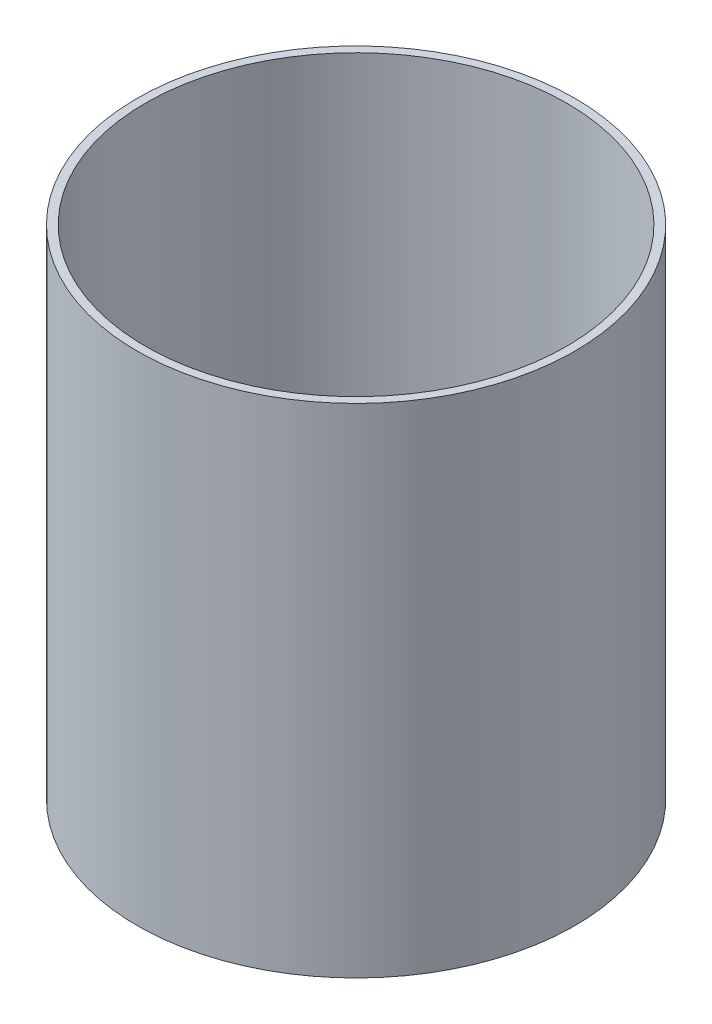
ISO-10303-21;
HEADER;
FILE_DESCRIPTION(('STEP AP214'),'2;1');
FILE_NAME('part.step','',(''),(''),'','','');
FILE_SCHEMA(('AUTOMOTIVE_DESIGN { 1 0 10303 214 1 1 1 1 }'));
ENDSEC;
DATA;
#1=APPLICATION_CONTEXT('core data for automotive mechanical design processes');
#2=APPLICATION_PROTOCOL_DEFINITION('international standard','automotive_design',2000,#1);
#3=PRODUCT_CONTEXT('',#1,'mechanical');
#4=PRODUCT('Part','Part','',(#3));
#5=PRODUCT_RELATED_PRODUCT_CATEGORY('part','',(#4));
#6=PRODUCT_DEFINITION_FORMATION('','',#4);
#7=PRODUCT_DEFINITION_CONTEXT('part definition',#1,'design');
#8=PRODUCT_DEFINITION('design','',#6,#7);
#9=PRODUCT_DEFINITION_SHAPE('','',#8);
#10=(LENGTH_UNIT() NAMED_UNIT(*) SI_UNIT(.MILLI.,.METRE.));
#11=(NAMED_UNIT(*) PLANE_ANGLE_UNIT() SI_UNIT($,.RADIAN.));
#12=(NAMED_UNIT(*) SI_UNIT($,.STERADIAN.) SOLID_ANGLE_UNIT());
#13=UNCERTAINTY_MEASURE_WITH_UNIT(LENGTH_MEASURE(1.E-05),#10,'distance_accuracy_value','');
#14=(GEOMETRIC_REPRESENTATION_CONTEXT(3) GLOBAL_UNCERTAINTY_ASSIGNED_CONTEXT((#13)) GLOBAL_UNIT_ASSIGNED_CONTEXT((#10,
#11,#12)) REPRESENTATION_CONTEXT('',''));
#15=CARTESIAN_POINT('',(0.,0.,0.));
#16=DIRECTION('',(0.,0.,1.));
#17=DIRECTION('',(1.,0.,0.));
#18=AXIS2_PLACEMENT_3D('',#15,#16,#17);
#19=CARTESIAN_POINT('',(0.,90.,0.));
#20=DIRECTION('',(0.,1.,0.));
#21=DIRECTION('',(0.,0.,1.));
#22=AXIS2_PLACEMENT_3D('',#19,#20,#21);
#23=PLANE('',#22);
#24=CARTESIAN_POINT('',(0.,90.,0.));
#25=DIRECTION('',(0.,1.,0.));
#26=DIRECTION('',(0.,0.,1.));
#27=AXIS2_PLACEMENT_3D('',#24,#25,#26);
#28=CIRCLE('',#27,39.6);
#29=CARTESIAN_POINT('',(0.,90.,-39.6));
#30=VERTEX_POINT('',#29);
#31=EDGE_CURVE('E10',#30,#30,#28,.T.);
#32=ORIENTED_EDGE('',*,*,#31,.T.);
#33=EDGE_LOOP('',(#32));
#34=FACE_BOUND('',#33,.T.);
#35=CARTESIAN_POINT('',(0.,90.,0.));
#36=DIRECTION('',(0.,1.,0.));
#37=DIRECTION('',(0.,0.,1.));
#38=AXIS2_PLACEMENT_3D('',#35,#36,#37);
#39=CIRCLE('',#38,38.1);
#40=CARTESIAN_POINT('',(0.,90.,-38.1));
#41=VERTEX_POINT('',#40);
#42=EDGE_CURVE('E45',#41,#41,#39,.T.);
#43=ORIENTED_EDGE('',*,*,#42,.F.);
#44=EDGE_LOOP('',(#43));
#45=FACE_BOUND('',#44,.T.);
#46=ADVANCED_FACE('F34',(#34,#45),#23,.T.);
#47=CARTESIAN_POINT('',(0.,0.,0.));
#48=DIRECTION('',(0.,1.,0.));
#49=DIRECTION('',(0.,0.,1.));
#50=AXIS2_PLACEMENT_3D('',#47,#48,#49);
#51=PLANE('',#50);
#52=CARTESIAN_POINT('',(0.,0.,0.));
#53=DIRECTION('',(0.,1.,0.));
#54=DIRECTION('',(0.,0.,1.));
#55=AXIS2_PLACEMENT_3D('',#52,#53,#54);
#56=CIRCLE('',#55,39.6);
#57=CARTESIAN_POINT('',(0.,0.,-39.6));
#58=VERTEX_POINT('',#57);
#59=EDGE_CURVE('E38',#58,#58,#56,.T.);
#60=ORIENTED_EDGE('',*,*,#59,.F.);
#61=EDGE_LOOP('',(#60));
#62=FACE_BOUND('',#61,.T.);
#63=CARTESIAN_POINT('',(0.,0.,0.));
#64=DIRECTION('',(0.,1.,0.));
#65=DIRECTION('',(0.,0.,1.));
#66=AXIS2_PLACEMENT_3D('',#63,#64,#65);
#67=CIRCLE('',#66,38.1);
#68=CARTESIAN_POINT('',(0.,0.,-38.1));
#69=VERTEX_POINT('',#68);
#70=EDGE_CURVE('E47',#69,#69,#67,.T.);
#71=ORIENTED_EDGE('',*,*,#70,.T.);
#72=EDGE_LOOP('',(#71));
#73=FACE_BOUND('',#72,.T.);
#74=ADVANCED_FACE('F57',(#62,#73),#51,.F.);
#75=CARTESIAN_POINT('',(0.,90.,0.));
#76=DIRECTION('',(0.,-1.,0.));
#77=DIRECTION('',(0.,0.,-1.));
#78=AXIS2_PLACEMENT_3D('',#75,#76,#77);
#79=CYLINDRICAL_SURFACE('',#78,39.6);
#80=CARTESIAN_POINT('',(0.,90.,-39.6));
#81=CARTESIAN_POINT('',(0.,89.0625,-39.6));
#82=CARTESIAN_POINT('',(0.,88.125,-39.6));
#83=CARTESIAN_POINT('',(0.,86.25,-39.6));
#84=CARTESIAN_POINT('',(0.,85.3125,-39.6));
#85=CARTESIAN_POINT('',(0.,83.4375,-39.6));
#86=CARTESIAN_POINT('',(0.,82.5,-39.6));
#87=CARTESIAN_POINT('',(0.,80.625,-39.6));
#88=CARTESIAN_POINT('',(0.,79.6875,-39.6));
#89=CARTESIAN_POINT('',(0.,77.8125,-39.6));
#90=CARTESIAN_POINT('',(0.,76.875,-39.6));
#91=CARTESIAN_POINT('',(0.,75.,-39.6));
#92=CARTESIAN_POINT('',(0.,74.0625,-39.6));
#93=CARTESIAN_POINT('',(0.,72.1875,-39.6));
#94=CARTESIAN_POINT('',(0.,71.25,-39.6));
#95=CARTESIAN_POINT('',(0.,69.375,-39.6));
#96=CARTESIAN_POINT('',(0.,68.4375,-39.6));
#97=CARTESIAN_POINT('',(0.,66.5625,-39.6));
#98=CARTESIAN_POINT('',(0.,65.625,-39.6));
#99=CARTESIAN_POINT('',(0.,63.75,-39.6));
#100=CARTESIAN_POINT('',(0.,62.8125,-39.6));
#101=CARTESIAN_POINT('',(0.,60.9375,-39.6));
#102=CARTESIAN_POINT('',(0.,60.,-39.6));
#103=CARTESIAN_POINT('',(0.,58.125,-39.6));
#104=CARTESIAN_POINT('',(0.,57.1875,-39.6));
#105=CARTESIAN_POINT('',(0.,55.3125,-39.6));
#106=CARTESIAN_POINT('',(0.,54.375,-39.6));
#107=CARTESIAN_POINT('',(0.,52.5,-39.6));
#108=CARTESIAN_POINT('',(0.,51.5625,-39.6));
#109=CARTESIAN_POINT('',(0.,49.6875,-39.6));
#110=CARTESIAN_POINT('',(0.,48.75,-39.6));
#111=CARTESIAN_POINT('',(0.,46.875,-39.6));
#112=CARTESIAN_POINT('',(0.,45.9375,-39.6));
#113=CARTESIAN_POINT('',(0.,44.0625,-39.6));
#114=CARTESIAN_POINT('',(0.,43.125,-39.6));
#115=CARTESIAN_POINT('',(0.,41.25,-39.6));
#116=CARTESIAN_POINT('',(0.,40.3125,-39.6));
#117=CARTESIAN_POINT('',(0.,38.4375,-39.6));
#118=CARTESIAN_POINT('',(0.,37.5,-39.6));
#119=CARTESIAN_POINT('',(0.,35.625,-39.6));
#120=CARTESIAN_POINT('',(0.,34.6875,-39.6));
#121=CARTESIAN_POINT('',(0.,32.8125,-39.6));
#122=CARTESIAN_POINT('',(0.,31.875,-39.6));
#123=CARTESIAN_POINT('',(0.,30.,-39.6));
#124=CARTESIAN_POINT('',(0.,29.0625,-39.6));
#125=CARTESIAN_POINT('',(0.,27.1875,-39.6));
#126=CARTESIAN_POINT('',(0.,26.25,-39.6));
#127=CARTESIAN_POINT('',(0.,24.375,-39.6));
#128=CARTESIAN_POINT('',(0.,23.4375,-39.6));
#129=CARTESIAN_POINT('',(0.,21.5625,-39.6));
#130=CARTESIAN_POINT('',(0.,20.625,-39.6));
#131=CARTESIAN_POINT('',(0.,18.75,-39.6));
#132=CARTESIAN_POINT('',(0.,17.8125,-39.6));
#133=CARTESIAN_POINT('',(0.,15.9375,-39.6));
#134=CARTESIAN_POINT('',(0.,15.,-39.6));
#135=CARTESIAN_POINT('',(0.,13.125,-39.6));
#136=CARTESIAN_POINT('',(0.,12.1875,-39.6));
#137=CARTESIAN_POINT('',(0.,10.3125,-39.6));
#138=CARTESIAN_POINT('',(0.,9.37499999999999,-39.6));
#139=CARTESIAN_POINT('',(0.,7.49999999999999,-39.6));
#140=CARTESIAN_POINT('',(0.,6.56249999999999,-39.6));
#141=CARTESIAN_POINT('',(0.,4.68749999999999,-39.6));
#142=CARTESIAN_POINT('',(0.,3.74999999999998,-39.6));
#143=CARTESIAN_POINT('',(0.,1.87499999999998,-39.6));
#144=CARTESIAN_POINT('',(0.,0.937499999999986,-39.6));
#145=CARTESIAN_POINT('',(0.,0.,-39.6));
#146=B_SPLINE_CURVE_WITH_KNOTS('',3,(#80,#81,#82,#83,#84,#85,#86,#87,#88,#89,#90,#91,#92,#93,
#94,#95,#96,#97,#98,#99,#100,#101,#102,#103,#104,#105,#106,#107,#108,#109,#110,#111,#112,#113,
#114,#115,#116,#117,#118,#119,#120,#121,#122,#123,#124,#125,#126,#127,#128,#129,#130,#131,#132,
#133,#134,#135,#136,#137,#138,#139,#140,#141,#142,#143,#144,#145),.UNSPECIFIED.,.F.,.F.,(4,2,2,
2,2,2,2,2,2,2,2,2,2,2,2,2,2,2,2,2,2,2,2,2,2,2,2,2,2,2,2,2,4),(0.,2.8125,5.62499999999999,
8.43749999999999,11.25,14.0625,16.875,19.6875,22.5,25.3125,28.125,30.9375,33.75,36.5625,39.375,
42.1875,45.,47.8125,50.625,53.4375,56.25,59.0625,61.875,64.6875,67.5,70.3125,73.125,75.9375,
78.75,81.5625,84.375,87.1875,90.),.UNSPECIFIED.);
#147=EDGE_CURVE('BSEAM36',#30,#58,#146,.T.);
#148=ORIENTED_EDGE('',*,*,#31,.F.);
#149=ORIENTED_EDGE('',*,*,#59,.T.);
#150=ORIENTED_EDGE('',*,*,#147,.T.);
#151=ORIENTED_EDGE('',*,*,#147,.F.);
#152=EDGE_LOOP('',(#148,#150,#149,#151));
#153=FACE_BOUND('',#152,.T.);
#154=ADVANCED_FACE('F36',(#153),#79,.T.);
#155=CARTESIAN_POINT('',(0.,90.,0.));
#156=DIRECTION('',(0.,-1.,0.));
#157=DIRECTION('',(0.,0.,-1.));
#158=AXIS2_PLACEMENT_3D('',#155,#156,#157);
#159=CYLINDRICAL_SURFACE('',#158,38.1);
#160=CARTESIAN_POINT('',(0.,90.,-38.1));
#161=CARTESIAN_POINT('',(0.,89.0625,-38.1));
#162=CARTESIAN_POINT('',(0.,88.125,-38.1));
#163=CARTESIAN_POINT('',(0.,86.25,-38.1));
#164=CARTESIAN_POINT('',(0.,85.3125,-38.1));
#165=CARTESIAN_POINT('',(0.,83.4375,-38.1));
#166=CARTESIAN_POINT('',(0.,82.5,-38.1));
#167=CARTESIAN_POINT('',(0.,80.625,-38.1));
#168=CARTESIAN_POINT('',(0.,79.6875,-38.1));
#169=CARTESIAN_POINT('',(0.,77.8125,-38.1));
#170=CARTESIAN_POINT('',(0.,76.875,-38.1));
#171=CARTESIAN_POINT('',(0.,75.,-38.1));
#172=CARTESIAN_POINT('',(0.,74.0625,-38.1));
#173=CARTESIAN_POINT('',(0.,72.1875,-38.1));
#174=CARTESIAN_POINT('',(0.,71.25,-38.1));
#175=CARTESIAN_POINT('',(0.,69.375,-38.1));
#176=CARTESIAN_POINT('',(0.,68.4375,-38.1));
#177=CARTESIAN_POINT('',(0.,66.5625,-38.1));
#178=CARTESIAN_POINT('',(0.,65.625,-38.1));
#179=CARTESIAN_POINT('',(0.,63.75,-38.1));
#180=CARTESIAN_POINT('',(0.,62.8125,-38.1));
#181=CARTESIAN_POINT('',(0.,60.9375,-38.1));
#182=CARTESIAN_POINT('',(0.,60.,-38.1));
#183=CARTESIAN_POINT('',(0.,58.125,-38.1));
#184=CARTESIAN_POINT('',(0.,57.1875,-38.1));
#185=CARTESIAN_POINT('',(0.,55.3125,-38.1));
#186=CARTESIAN_POINT('',(0.,54.375,-38.1));
#187=CARTESIAN_POINT('',(0.,52.5,-38.1));
#188=CARTESIAN_POINT('',(0.,51.5625,-38.1));
#189=CARTESIAN_POINT('',(0.,49.6875,-38.1));
#190=CARTESIAN_POINT('',(0.,48.75,-38.1));
#191=CARTESIAN_POINT('',(0.,46.875,-38.1));
#192=CARTESIAN_POINT('',(0.,45.9375,-38.1));
#193=CARTESIAN_POINT('',(0.,44.0625,-38.1));
#194=CARTESIAN_POINT('',(0.,43.125,-38.1));
#195=CARTESIAN_POINT('',(0.,41.25,-38.1));
#196=CARTESIAN_POINT('',(0.,40.3125,-38.1));
#197=CARTESIAN_POINT('',(0.,38.4375,-38.1));
#198=CARTESIAN_POINT('',(0.,37.5,-38.1));
#199=CARTESIAN_POINT('',(0.,35.625,-38.1));
#200=CARTESIAN_POINT('',(0.,34.6875,-38.1));
#201=CARTESIAN_POINT('',(0.,32.8125,-38.1));
#202=CARTESIAN_POINT('',(0.,31.875,-38.1));
#203=CARTESIAN_POINT('',(0.,30.,-38.1));
#204=CARTESIAN_POINT('',(0.,29.0625,-38.1));
#205=CARTESIAN_POINT('',(0.,27.1875,-38.1));
#206=CARTESIAN_POINT('',(0.,26.25,-38.1));
#207=CARTESIAN_POINT('',(0.,24.375,-38.1));
#208=CARTESIAN_POINT('',(0.,23.4375,-38.1));
#209=CARTESIAN_POINT('',(0.,21.5625,-38.1));
#210=CARTESIAN_POINT('',(0.,20.625,-38.1));
#211=CARTESIAN_POINT('',(0.,18.75,-38.1));
#212=CARTESIAN_POINT('',(0.,17.8125,-38.1));
#213=CARTESIAN_POINT('',(0.,15.9375,-38.1));
#214=CARTESIAN_POINT('',(0.,15.,-38.1));
#215=CARTESIAN_POINT('',(0.,13.125,-38.1));
#216=CARTESIAN_POINT('',(0.,12.1875,-38.1));
#217=CARTESIAN_POINT('',(0.,10.3125,-38.1));
#218=CARTESIAN_POINT('',(0.,9.37499999999999,-38.1));
#219=CARTESIAN_POINT('',(0.,7.49999999999999,-38.1));
#220=CARTESIAN_POINT('',(0.,6.56249999999999,-38.1));
#221=CARTESIAN_POINT('',(0.,4.68749999999999,-38.1));
#222=CARTESIAN_POINT('',(0.,3.74999999999998,-38.1));
#223=CARTESIAN_POINT('',(0.,1.87499999999998,-38.1));
#224=CARTESIAN_POINT('',(0.,0.937499999999986,-38.1));
#225=CARTESIAN_POINT('',(0.,0.,-38.1));
#226=B_SPLINE_CURVE_WITH_KNOTS('',3,(#160,#161,#162,#163,#164,#165,#166,#167,#168,#169,#170,
#171,#172,#173,#174,#175,#176,#177,#178,#179,#180,#181,#182,#183,#184,#185,#186,#187,#188,#189,
#190,#191,#192,#193,#194,#195,#196,#197,#198,#199,#200,#201,#202,#203,#204,#205,#206,#207,#208,
#209,#210,#211,#212,#213,#214,#215,#216,#217,#218,#219,#220,#221,#222,#223,#224,#225),
.UNSPECIFIED.,.F.,.F.,(4,2,2,2,2,2,2,2,2,2,2,2,2,2,2,2,2,2,2,2,2,2,2,2,2,2,2,2,2,2,2,2,4),(0.,
2.81250000000001,5.62500000000001,8.43750000000001,11.25,14.0625,16.875,19.6875,22.5,25.3125,
28.125,30.9375,33.75,36.5625,39.375,42.1875,45.,47.8125,50.625,53.4375,56.25,59.0625,61.875,
64.6875,67.5,70.3125,73.125,75.9375,78.75,81.5625,84.375,87.1875,90.),.UNSPECIFIED.);
#227=EDGE_CURVE('BSEAM53',#41,#69,#226,.T.);
#228=ORIENTED_EDGE('',*,*,#42,.T.);
#229=ORIENTED_EDGE('',*,*,#70,.F.);
#230=ORIENTED_EDGE('',*,*,#227,.T.);
#231=ORIENTED_EDGE('',*,*,#227,.F.);
#232=EDGE_LOOP('',(#228,#230,#229,#231));
#233=FACE_BOUND('',#232,.T.);
#234=ADVANCED_FACE('F53',(#233),#159,.F.);
#235=CLOSED_SHELL('',(#46,#74,#154,#234));
#236=MANIFOLD_SOLID_BREP('B2',#235);
#237=ADVANCED_BREP_SHAPE_REPRESENTATION('',(#18,#236),#14);
#238=SHAPE_DEFINITION_REPRESENTATION(#9,#237);
ENDSEC;
END-ISO-10303-21;
